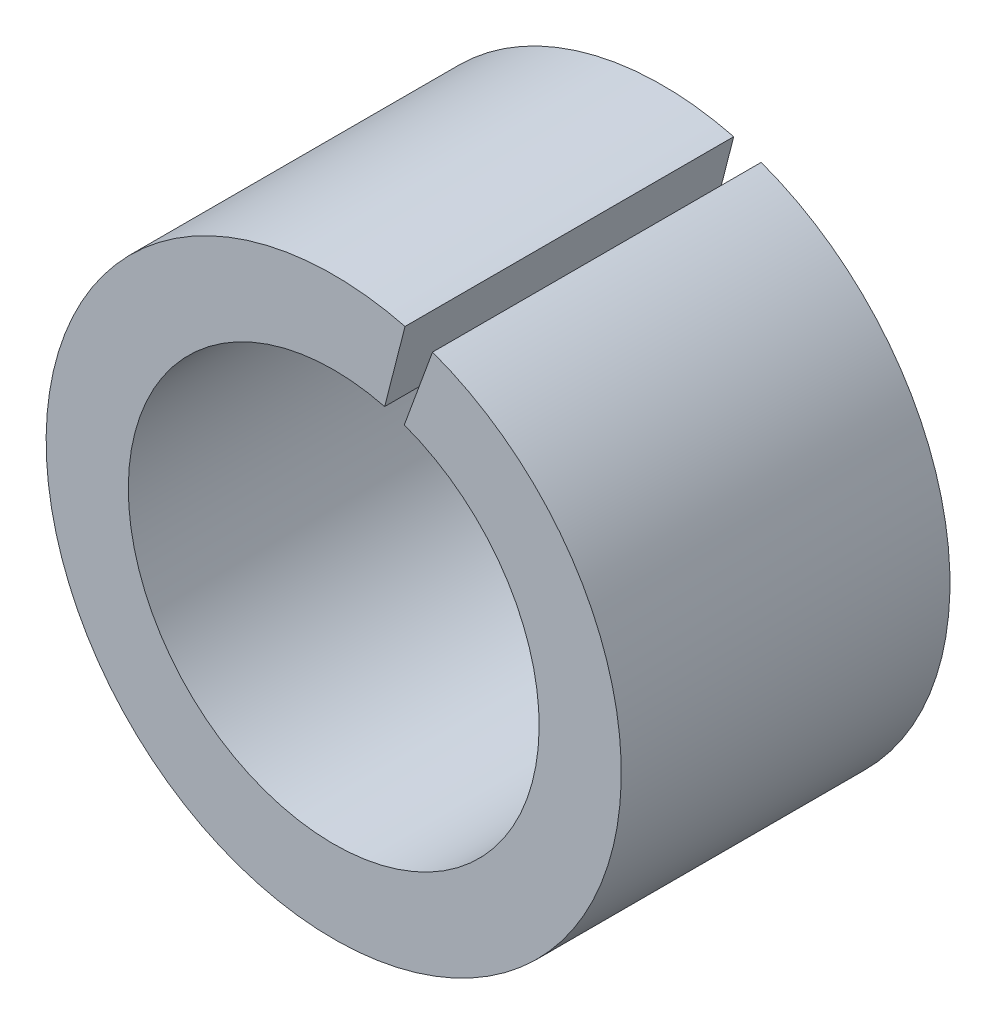
ISO-10303-21;
HEADER;
FILE_DESCRIPTION(('STEP AP214'),'2;1');
FILE_NAME('part.step','',(''),(''),'','','');
FILE_SCHEMA(('AUTOMOTIVE_DESIGN { 1 0 10303 214 1 1 1 1 }'));
ENDSEC;
DATA;
#1=APPLICATION_CONTEXT('core data for automotive mechanical design processes');
#2=APPLICATION_PROTOCOL_DEFINITION('international standard','automotive_design',2000,#1);
#3=PRODUCT_CONTEXT('',#1,'mechanical');
#4=PRODUCT('Part','Part','',(#3));
#5=PRODUCT_RELATED_PRODUCT_CATEGORY('part','',(#4));
#6=PRODUCT_DEFINITION_FORMATION('','',#4);
#7=PRODUCT_DEFINITION_CONTEXT('part definition',#1,'design');
#8=PRODUCT_DEFINITION('design','',#6,#7);
#9=PRODUCT_DEFINITION_SHAPE('','',#8);
#10=(LENGTH_UNIT() NAMED_UNIT(*) SI_UNIT(.MILLI.,.METRE.));
#11=(NAMED_UNIT(*) PLANE_ANGLE_UNIT() SI_UNIT($,.RADIAN.));
#12=(NAMED_UNIT(*) SI_UNIT($,.STERADIAN.) SOLID_ANGLE_UNIT());
#13=UNCERTAINTY_MEASURE_WITH_UNIT(LENGTH_MEASURE(1.E-05),#10,'distance_accuracy_value','');
#14=(GEOMETRIC_REPRESENTATION_CONTEXT(3) GLOBAL_UNCERTAINTY_ASSIGNED_CONTEXT((#13)) GLOBAL_UNIT_ASSIGNED_CONTEXT((#10,
#11,#12)) REPRESENTATION_CONTEXT('',''));
#15=CARTESIAN_POINT('',(0.,0.,0.));
#16=DIRECTION('',(0.,0.,1.));
#17=DIRECTION('',(1.,0.,0.));
#18=AXIS2_PLACEMENT_3D('',#15,#16,#17);
#19=CARTESIAN_POINT('',(0.,0.,4.));
#20=DIRECTION('',(0.,0.,1.));
#21=DIRECTION('',(1.,0.,0.));
#22=AXIS2_PLACEMENT_3D('',#19,#20,#21);
#23=PLANE('',#22);
#24=DIRECTION('',(0.343504443632542,0.939151051324917,0.));
#25=VECTOR('',#24,1.);
#26=CARTESIAN_POINT('',(1.70817035910886,4.67018700437904,4.));
#27=LINE('',#26,#25);
#28=CARTESIAN_POINT('',(0.858761109081354,2.34787762831229,4.));
#29=VERTEX_POINT('',#28);
#30=CARTESIAN_POINT('',(1.2022655527139,3.28702867963721,4.));
#31=VERTEX_POINT('',#30);
#32=EDGE_CURVE('E74',#29,#31,#27,.T.);
#33=ORIENTED_EDGE('',*,*,#32,.F.);
#34=CARTESIAN_POINT('',(0.,0.,4.));
#35=DIRECTION('',(0.,0.,1.));
#36=DIRECTION('',(1.,0.,0.));
#37=AXIS2_PLACEMENT_3D('',#34,#35,#36);
#38=CIRCLE('',#37,2.5);
#39=CARTESIAN_POINT('',(0.620042865626918,2.42188910662424,4.));
#40=VERTEX_POINT('',#39);
#41=EDGE_CURVE('E83',#40,#29,#38,.T.);
#42=ORIENTED_EDGE('',*,*,#41,.F.);
#43=DIRECTION('',(-0.248017146250767,-0.968755642649696,0.));
#44=VECTOR('',#43,1.);
#45=CARTESIAN_POINT('',(0.,0.,4.));
#46=LINE('',#45,#44);
#47=CARTESIAN_POINT('',(0.868060011877686,3.39064474927394,4.));
#48=VERTEX_POINT('',#47);
#49=EDGE_CURVE('E57',#48,#40,#46,.T.);
#50=ORIENTED_EDGE('',*,*,#49,.F.);
#51=CARTESIAN_POINT('',(0.,0.,4.));
#52=DIRECTION('',(0.,0.,1.));
#53=DIRECTION('',(1.,0.,0.));
#54=AXIS2_PLACEMENT_3D('',#51,#52,#53);
#55=CIRCLE('',#54,3.5);
#56=EDGE_CURVE('E85',#48,#31,#55,.T.);
#57=ORIENTED_EDGE('',*,*,#56,.T.);
#58=EDGE_LOOP('',(#33,#42,#50,#57));
#59=FACE_BOUND('',#58,.T.);
#60=ADVANCED_FACE('F35',(#59),#23,.T.);
#61=CARTESIAN_POINT('',(0.,0.,0.));
#62=DIRECTION('',(0.,0.,1.));
#63=DIRECTION('',(1.,0.,0.));
#64=AXIS2_PLACEMENT_3D('',#61,#62,#63);
#65=PLANE('',#64);
#66=CARTESIAN_POINT('',(0.,0.,0.));
#67=DIRECTION('',(0.,0.,1.));
#68=DIRECTION('',(1.,0.,0.));
#69=AXIS2_PLACEMENT_3D('',#66,#67,#68);
#70=CIRCLE('',#69,2.5);
#71=CARTESIAN_POINT('',(0.620042865626918,2.42188910662424,0.));
#72=VERTEX_POINT('',#71);
#73=CARTESIAN_POINT('',(0.858761109081354,2.34787762831229,0.));
#74=VERTEX_POINT('',#73);
#75=EDGE_CURVE('E89',#72,#74,#70,.T.);
#76=ORIENTED_EDGE('',*,*,#75,.T.);
#77=DIRECTION('',(0.343504443632542,0.939151051324918,0.));
#78=VECTOR('',#77,1.);
#79=CARTESIAN_POINT('',(0.,0.,0.));
#80=LINE('',#79,#78);
#81=CARTESIAN_POINT('',(1.2022655527139,3.28702867963721,0.));
#82=VERTEX_POINT('',#81);
#83=EDGE_CURVE('E49',#74,#82,#80,.T.);
#84=ORIENTED_EDGE('',*,*,#83,.T.);
#85=CARTESIAN_POINT('',(0.,0.,0.));
#86=DIRECTION('',(0.,0.,1.));
#87=DIRECTION('',(1.,0.,0.));
#88=AXIS2_PLACEMENT_3D('',#85,#86,#87);
#89=CIRCLE('',#88,3.5);
#90=CARTESIAN_POINT('',(0.868060011877686,3.39064474927394,0.));
#91=VERTEX_POINT('',#90);
#92=EDGE_CURVE('E88',#91,#82,#89,.T.);
#93=ORIENTED_EDGE('',*,*,#92,.F.);
#94=DIRECTION('',(-0.248017146250767,-0.968755642649696,0.));
#95=VECTOR('',#94,1.);
#96=CARTESIAN_POINT('',(0.,0.,0.));
#97=LINE('',#96,#95);
#98=EDGE_CURVE('E100',#91,#72,#97,.T.);
#99=ORIENTED_EDGE('',*,*,#98,.T.);
#100=EDGE_LOOP('',(#76,#84,#93,#99));
#101=FACE_BOUND('',#100,.T.);
#102=ADVANCED_FACE('F104',(#101),#65,.F.);
#103=CARTESIAN_POINT('',(0.,0.,4.));
#104=DIRECTION('',(0.,0.,-1.));
#105=DIRECTION('',(-1.,0.,0.));
#106=AXIS2_PLACEMENT_3D('',#103,#104,#105);
#107=CYLINDRICAL_SURFACE('',#106,3.5);
#108=ORIENTED_EDGE('',*,*,#92,.T.);
#109=DIRECTION('',(0.,0.,-1.));
#110=VECTOR('',#109,1.);
#111=CARTESIAN_POINT('',(1.2022655527139,3.28702867963721,4.));
#112=LINE('',#111,#110);
#113=EDGE_CURVE('E93',#82,#31,#112,.F.);
#114=ORIENTED_EDGE('',*,*,#113,.T.);
#115=ORIENTED_EDGE('',*,*,#56,.F.);
#116=DIRECTION('',(0.,0.,-1.));
#117=VECTOR('',#116,1.);
#118=CARTESIAN_POINT('',(0.868060011877686,3.39064474927394,4.));
#119=LINE('',#118,#117);
#120=EDGE_CURVE('E105',#48,#91,#119,.T.);
#121=ORIENTED_EDGE('',*,*,#120,.T.);
#122=EDGE_LOOP('',(#108,#114,#115,#121));
#123=FACE_BOUND('',#122,.T.);
#124=ADVANCED_FACE('F37',(#123),#107,.T.);
#125=CARTESIAN_POINT('',(0.,0.,4.));
#126=DIRECTION('',(0.,0.,-1.));
#127=DIRECTION('',(-1.,0.,0.));
#128=AXIS2_PLACEMENT_3D('',#125,#126,#127);
#129=CYLINDRICAL_SURFACE('',#128,2.5);
#130=DIRECTION('',(0.,0.,-1.));
#131=VECTOR('',#130,1.);
#132=CARTESIAN_POINT('',(0.858761109081354,2.34787762831229,4.));
#133=LINE('',#132,#131);
#134=EDGE_CURVE('E11',#74,#29,#133,.F.);
#135=ORIENTED_EDGE('',*,*,#134,.F.);
#136=ORIENTED_EDGE('',*,*,#75,.F.);
#137=DIRECTION('',(0.,0.,-1.));
#138=VECTOR('',#137,1.);
#139=CARTESIAN_POINT('',(0.620042865626918,2.42188910662424,4.));
#140=LINE('',#139,#138);
#141=EDGE_CURVE('E43',#40,#72,#140,.T.);
#142=ORIENTED_EDGE('',*,*,#141,.F.);
#143=ORIENTED_EDGE('',*,*,#41,.T.);
#144=EDGE_LOOP('',(#135,#136,#142,#143));
#145=FACE_BOUND('',#144,.T.);
#146=ADVANCED_FACE('F87',(#145),#129,.F.);
#147=CARTESIAN_POINT('',(0.,0.,-2.));
#148=DIRECTION('',(-0.968755642649696,0.248017146250767,0.));
#149=DIRECTION('',(-0.248017146250767,-0.968755642649696,0.));
#150=AXIS2_PLACEMENT_3D('',#147,#148,#149);
#151=PLANE('',#150);
#152=ORIENTED_EDGE('',*,*,#49,.T.);
#153=ORIENTED_EDGE('',*,*,#141,.T.);
#154=ORIENTED_EDGE('',*,*,#98,.F.);
#155=ORIENTED_EDGE('',*,*,#120,.F.);
#156=EDGE_LOOP('',(#152,#153,#154,#155));
#157=FACE_BOUND('',#156,.T.);
#158=ADVANCED_FACE('F99',(#157),#151,.F.);
#159=CARTESIAN_POINT('',(1.70817035910886,4.67018700437904,-2.));
#160=DIRECTION('',(0.939151051324918,-0.343504443632542,0.));
#161=DIRECTION('',(0.343504443632542,0.939151051324918,0.));
#162=AXIS2_PLACEMENT_3D('',#159,#160,#161);
#163=PLANE('',#162);
#164=ORIENTED_EDGE('',*,*,#83,.F.);
#165=ORIENTED_EDGE('',*,*,#134,.T.);
#166=ORIENTED_EDGE('',*,*,#32,.T.);
#167=ORIENTED_EDGE('',*,*,#113,.F.);
#168=EDGE_LOOP('',(#164,#165,#166,#167));
#169=FACE_BOUND('',#168,.T.);
#170=ADVANCED_FACE('F73',(#169),#163,.F.);
#171=CLOSED_SHELL('',(#60,#102,#124,#146,#158,#170));
#172=MANIFOLD_SOLID_BREP('B2',#171);
#173=ADVANCED_BREP_SHAPE_REPRESENTATION('',(#18,#172),#14);
#174=SHAPE_DEFINITION_REPRESENTATION(#9,#173);
ENDSEC;
END-ISO-10303-21;
